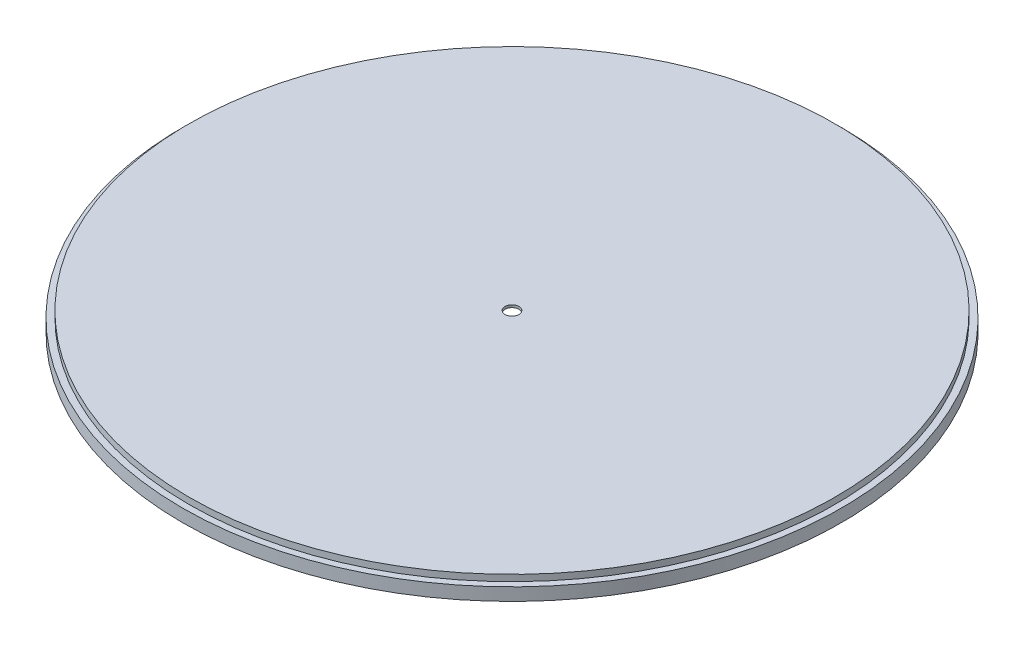
ISO-10303-21;
HEADER;
FILE_DESCRIPTION(('STEP AP214'),'2;1');
FILE_NAME('part.step','',(''),(''),'','','');
FILE_SCHEMA(('AUTOMOTIVE_DESIGN { 1 0 10303 214 1 1 1 1 }'));
ENDSEC;
DATA;
#1=APPLICATION_CONTEXT('core data for automotive mechanical design processes');
#2=APPLICATION_PROTOCOL_DEFINITION('international standard','automotive_design',2000,#1);
#3=PRODUCT_CONTEXT('',#1,'mechanical');
#4=PRODUCT('Part','Part','',(#3));
#5=PRODUCT_RELATED_PRODUCT_CATEGORY('part','',(#4));
#6=PRODUCT_DEFINITION_FORMATION('','',#4);
#7=PRODUCT_DEFINITION_CONTEXT('part definition',#1,'design');
#8=PRODUCT_DEFINITION('design','',#6,#7);
#9=PRODUCT_DEFINITION_SHAPE('','',#8);
#10=(LENGTH_UNIT() NAMED_UNIT(*) SI_UNIT(.MILLI.,.METRE.));
#11=(NAMED_UNIT(*) PLANE_ANGLE_UNIT() SI_UNIT($,.RADIAN.));
#12=(NAMED_UNIT(*) SI_UNIT($,.STERADIAN.) SOLID_ANGLE_UNIT());
#13=UNCERTAINTY_MEASURE_WITH_UNIT(LENGTH_MEASURE(1.E-05),#10,'distance_accuracy_value','');
#14=(GEOMETRIC_REPRESENTATION_CONTEXT(3) GLOBAL_UNCERTAINTY_ASSIGNED_CONTEXT((#13)) GLOBAL_UNIT_ASSIGNED_CONTEXT((#10,
#11,#12)) REPRESENTATION_CONTEXT('',''));
#15=CARTESIAN_POINT('',(0.,0.,0.));
#16=DIRECTION('',(0.,0.,1.));
#17=DIRECTION('',(1.,0.,0.));
#18=AXIS2_PLACEMENT_3D('',#15,#16,#17);
#19=CARTESIAN_POINT('',(0.,-1.5,0.));
#20=DIRECTION('',(0.,1.,0.));
#21=DIRECTION('',(0.,0.,1.));
#22=AXIS2_PLACEMENT_3D('',#19,#20,#21);
#23=CYLINDRICAL_SURFACE('',#22,25.5);
#24=CARTESIAN_POINT('',(0.,0.,0.));
#25=DIRECTION('',(0.,1.,0.));
#26=DIRECTION('',(0.,0.,1.));
#27=AXIS2_PLACEMENT_3D('',#24,#25,#26);
#28=CIRCLE('',#27,25.5);
#29=CARTESIAN_POINT('',(0.,0.,25.5));
#30=VERTEX_POINT('',#29);
#31=EDGE_CURVE('E10',#30,#30,#28,.T.);
#32=ORIENTED_EDGE('',*,*,#31,.F.);
#33=EDGE_LOOP('',(#32));
#34=FACE_BOUND('',#33,.T.);
#35=CARTESIAN_POINT('',(0.,-0.5,0.));
#36=DIRECTION('',(0.,-1.,0.));
#37=DIRECTION('',(0.,0.,-1.));
#38=AXIS2_PLACEMENT_3D('',#35,#36,#37);
#39=CIRCLE('',#38,25.5);
#40=CARTESIAN_POINT('',(0.,-0.5,-25.5));
#41=VERTEX_POINT('',#40);
#42=EDGE_CURVE('E44',#41,#41,#39,.F.);
#43=ORIENTED_EDGE('',*,*,#42,.T.);
#44=EDGE_LOOP('',(#43));
#45=FACE_BOUND('',#44,.T.);
#46=ADVANCED_FACE('F41',(#34,#45),#23,.T.);
#47=CARTESIAN_POINT('',(0.,0.,0.));
#48=DIRECTION('',(0.,1.,0.));
#49=DIRECTION('',(0.,0.,1.));
#50=AXIS2_PLACEMENT_3D('',#47,#48,#49);
#51=PLANE('',#50);
#52=CARTESIAN_POINT('',(0.,0.,0.));
#53=DIRECTION('',(0.,-1.,0.));
#54=DIRECTION('',(0.,0.,-1.));
#55=AXIS2_PLACEMENT_3D('',#52,#53,#54);
#56=CIRCLE('',#55,0.55);
#57=CARTESIAN_POINT('',(0.,0.,-0.55));
#58=VERTEX_POINT('',#57);
#59=EDGE_CURVE('E64',#58,#58,#56,.T.);
#60=ORIENTED_EDGE('',*,*,#59,.T.);
#61=EDGE_LOOP('',(#60));
#62=FACE_BOUND('',#61,.T.);
#63=ORIENTED_EDGE('',*,*,#31,.T.);
#64=EDGE_LOOP('',(#63));
#65=FACE_BOUND('',#64,.T.);
#66=ADVANCED_FACE('F68',(#62,#65),#51,.T.);
#67=CARTESIAN_POINT('',(0.,-0.5,0.));
#68=DIRECTION('',(0.,-1.,0.));
#69=DIRECTION('',(0.,0.,-1.));
#70=AXIS2_PLACEMENT_3D('',#67,#68,#69);
#71=CYLINDRICAL_SURFACE('',#70,26.);
#72=CARTESIAN_POINT('',(0.,-0.5,0.));
#73=DIRECTION('',(0.,-1.,0.));
#74=DIRECTION('',(0.,0.,-1.));
#75=AXIS2_PLACEMENT_3D('',#72,#73,#74);
#76=CIRCLE('',#75,26.);
#77=CARTESIAN_POINT('',(0.,-0.5,-26.));
#78=VERTEX_POINT('',#77);
#79=EDGE_CURVE('E51',#78,#78,#76,.T.);
#80=ORIENTED_EDGE('',*,*,#79,.T.);
#81=EDGE_LOOP('',(#80));
#82=FACE_BOUND('',#81,.T.);
#83=CARTESIAN_POINT('',(0.,-1.5,0.));
#84=DIRECTION('',(0.,-1.,0.));
#85=DIRECTION('',(0.,0.,-1.));
#86=AXIS2_PLACEMENT_3D('',#83,#84,#85);
#87=CIRCLE('',#86,26.);
#88=CARTESIAN_POINT('',(0.,-1.5,-26.));
#89=VERTEX_POINT('',#88);
#90=EDGE_CURVE('E53',#89,#89,#87,.T.);
#91=ORIENTED_EDGE('',*,*,#90,.F.);
#92=EDGE_LOOP('',(#91));
#93=FACE_BOUND('',#92,.T.);
#94=ADVANCED_FACE('F89',(#82,#93),#71,.T.);
#95=CARTESIAN_POINT('',(0.,-0.5,0.));
#96=DIRECTION('',(0.,-1.,0.));
#97=DIRECTION('',(0.,0.,-1.));
#98=AXIS2_PLACEMENT_3D('',#95,#96,#97);
#99=PLANE('',#98);
#100=ORIENTED_EDGE('',*,*,#42,.F.);
#101=EDGE_LOOP('',(#100));
#102=FACE_BOUND('',#101,.T.);
#103=ORIENTED_EDGE('',*,*,#79,.F.);
#104=EDGE_LOOP('',(#103));
#105=FACE_BOUND('',#104,.T.);
#106=ADVANCED_FACE('F85',(#102,#105),#99,.F.);
#107=CARTESIAN_POINT('',(0.,-1.5,0.));
#108=DIRECTION('',(0.,1.,0.));
#109=DIRECTION('',(0.,0.,1.));
#110=AXIS2_PLACEMENT_3D('',#107,#108,#109);
#111=PLANE('',#110);
#112=CARTESIAN_POINT('',(0.,-1.5,0.));
#113=DIRECTION('',(0.,-1.,0.));
#114=DIRECTION('',(0.,0.,-1.));
#115=AXIS2_PLACEMENT_3D('',#112,#113,#114);
#116=CIRCLE('',#115,4.35);
#117=CARTESIAN_POINT('',(0.,-1.5,-4.35));
#118=VERTEX_POINT('',#117);
#119=EDGE_CURVE('E56',#118,#118,#116,.T.);
#120=ORIENTED_EDGE('',*,*,#119,.F.);
#121=EDGE_LOOP('',(#120));
#122=FACE_BOUND('',#121,.T.);
#123=ORIENTED_EDGE('',*,*,#90,.T.);
#124=EDGE_LOOP('',(#123));
#125=FACE_BOUND('',#124,.T.);
#126=ADVANCED_FACE('F79',(#122,#125),#111,.F.);
#127=CARTESIAN_POINT('',(0.,-1.5,0.));
#128=DIRECTION('',(0.,-1.,0.));
#129=DIRECTION('',(0.,0.,-1.));
#130=AXIS2_PLACEMENT_3D('',#127,#128,#129);
#131=CONICAL_SURFACE('',#130,4.35,1.24117191937415);
#132=CARTESIAN_POINT('',(0.,-0.2,0.));
#133=DIRECTION('',(0.,-1.,0.));
#134=DIRECTION('',(0.,0.,-1.));
#135=AXIS2_PLACEMENT_3D('',#132,#133,#134);
#136=CIRCLE('',#135,0.55);
#137=CARTESIAN_POINT('',(0.,-0.2,-0.549999999999999));
#138=VERTEX_POINT('',#137);
#139=EDGE_CURVE('E61',#138,#138,#136,.T.);
#140=CARTESIAN_POINT('',(0.,-0.2,-0.549999999999999));
#141=CARTESIAN_POINT('',(0.,-0.213541666666667,-0.589583333333332));
#142=CARTESIAN_POINT('',(0.,-0.227083333333333,-0.629166666666666));
#143=CARTESIAN_POINT('',(0.,-0.254166666666667,-0.708333333333332));
#144=CARTESIAN_POINT('',(0.,-0.267708333333333,-0.747916666666665));
#145=CARTESIAN_POINT('',(0.,-0.294791666666667,-0.827083333333332));
#146=CARTESIAN_POINT('',(0.,-0.308333333333333,-0.866666666666666));
#147=CARTESIAN_POINT('',(0.,-0.335416666666667,-0.945833333333332));
#148=CARTESIAN_POINT('',(0.,-0.348958333333333,-0.985416666666665));
#149=CARTESIAN_POINT('',(0.,-0.376041666666667,-1.06458333333333));
#150=CARTESIAN_POINT('',(0.,-0.389583333333333,-1.10416666666667));
#151=CARTESIAN_POINT('',(0.,-0.416666666666667,-1.18333333333333));
#152=CARTESIAN_POINT('',(0.,-0.430208333333333,-1.22291666666667));
#153=CARTESIAN_POINT('',(0.,-0.457291666666667,-1.30208333333333));
#154=CARTESIAN_POINT('',(0.,-0.470833333333333,-1.34166666666667));
#155=CARTESIAN_POINT('',(0.,-0.497916666666667,-1.42083333333333));
#156=CARTESIAN_POINT('',(0.,-0.511458333333333,-1.46041666666667));
#157=CARTESIAN_POINT('',(0.,-0.538541666666667,-1.53958333333333));
#158=CARTESIAN_POINT('',(0.,-0.552083333333333,-1.57916666666667));
#159=CARTESIAN_POINT('',(0.,-0.579166666666667,-1.65833333333333));
#160=CARTESIAN_POINT('',(0.,-0.592708333333333,-1.69791666666667));
#161=CARTESIAN_POINT('',(0.,-0.619791666666667,-1.77708333333333));
#162=CARTESIAN_POINT('',(0.,-0.633333333333333,-1.81666666666667));
#163=CARTESIAN_POINT('',(0.,-0.660416666666667,-1.89583333333333));
#164=CARTESIAN_POINT('',(0.,-0.673958333333333,-1.93541666666667));
#165=CARTESIAN_POINT('',(0.,-0.701041666666667,-2.01458333333333));
#166=CARTESIAN_POINT('',(0.,-0.714583333333333,-2.05416666666667));
#167=CARTESIAN_POINT('',(0.,-0.741666666666667,-2.13333333333333));
#168=CARTESIAN_POINT('',(0.,-0.755208333333333,-2.17291666666667));
#169=CARTESIAN_POINT('',(0.,-0.782291666666667,-2.25208333333333));
#170=CARTESIAN_POINT('',(0.,-0.795833333333333,-2.29166666666667));
#171=CARTESIAN_POINT('',(0.,-0.822916666666667,-2.37083333333333));
#172=CARTESIAN_POINT('',(0.,-0.836458333333333,-2.41041666666667));
#173=CARTESIAN_POINT('',(0.,-0.863541666666667,-2.48958333333333));
#174=CARTESIAN_POINT('',(0.,-0.877083333333333,-2.52916666666667));
#175=CARTESIAN_POINT('',(0.,-0.904166666666667,-2.60833333333333));
#176=CARTESIAN_POINT('',(0.,-0.917708333333333,-2.64791666666667));
#177=CARTESIAN_POINT('',(0.,-0.944791666666667,-2.72708333333333));
#178=CARTESIAN_POINT('',(0.,-0.958333333333333,-2.76666666666667));
#179=CARTESIAN_POINT('',(0.,-0.985416666666667,-2.84583333333333));
#180=CARTESIAN_POINT('',(0.,-0.998958333333333,-2.88541666666667));
#181=CARTESIAN_POINT('',(0.,-1.02604166666667,-2.96458333333333));
#182=CARTESIAN_POINT('',(0.,-1.03958333333333,-3.00416666666667));
#183=CARTESIAN_POINT('',(0.,-1.06666666666667,-3.08333333333333));
#184=CARTESIAN_POINT('',(0.,-1.08020833333333,-3.12291666666667));
#185=CARTESIAN_POINT('',(0.,-1.10729166666667,-3.20208333333333));
#186=CARTESIAN_POINT('',(0.,-1.12083333333333,-3.24166666666667));
#187=CARTESIAN_POINT('',(0.,-1.14791666666667,-3.32083333333333));
#188=CARTESIAN_POINT('',(0.,-1.16145833333333,-3.36041666666667));
#189=CARTESIAN_POINT('',(0.,-1.18854166666667,-3.43958333333333));
#190=CARTESIAN_POINT('',(0.,-1.20208333333333,-3.47916666666667));
#191=CARTESIAN_POINT('',(0.,-1.22916666666667,-3.55833333333333));
#192=CARTESIAN_POINT('',(0.,-1.24270833333333,-3.59791666666667));
#193=CARTESIAN_POINT('',(0.,-1.26979166666667,-3.67708333333333));
#194=CARTESIAN_POINT('',(0.,-1.28333333333333,-3.71666666666667));
#195=CARTESIAN_POINT('',(0.,-1.31041666666667,-3.79583333333333));
#196=CARTESIAN_POINT('',(0.,-1.32395833333333,-3.83541666666667));
#197=CARTESIAN_POINT('',(0.,-1.35104166666667,-3.91458333333333));
#198=CARTESIAN_POINT('',(0.,-1.36458333333333,-3.95416666666667));
#199=CARTESIAN_POINT('',(0.,-1.39166666666667,-4.03333333333333));
#200=CARTESIAN_POINT('',(0.,-1.40520833333333,-4.07291666666667));
#201=CARTESIAN_POINT('',(0.,-1.43229166666667,-4.15208333333333));
#202=CARTESIAN_POINT('',(0.,-1.44583333333333,-4.19166666666667));
#203=CARTESIAN_POINT('',(0.,-1.47291666666667,-4.27083333333333));
#204=CARTESIAN_POINT('',(0.,-1.48645833333333,-4.31041666666667));
#205=CARTESIAN_POINT('',(0.,-1.5,-4.35));
#206=B_SPLINE_CURVE_WITH_KNOTS('',3,(#140,#141,#142,#143,#144,#145,#146,#147,#148,#149,#150,
#151,#152,#153,#154,#155,#156,#157,#158,#159,#160,#161,#162,#163,#164,#165,#166,#167,#168,#169,
#170,#171,#172,#173,#174,#175,#176,#177,#178,#179,#180,#181,#182,#183,#184,#185,#186,#187,#188,
#189,#190,#191,#192,#193,#194,#195,#196,#197,#198,#199,#200,#201,#202,#203,#204,#205),
.UNSPECIFIED.,.F.,.F.,(4,2,2,2,2,2,2,2,2,2,2,2,2,2,2,2,2,2,2,2,2,2,2,2,2,2,2,2,2,2,2,2,4),(0.,
0.125506785175145,0.25101357035029,0.376520355525435,0.50202714070058,0.627533925875725,
0.753040711050871,0.878547496226015,1.00405428140116,1.12956106657631,1.25506785175145,
1.3805746369266,1.50608142210174,1.63158820727689,1.75709499245203,1.88260177762718,
2.00810856280232,2.13361534797747,2.25912213315261,2.38462891832776,2.5101357035029,
2.63564248867805,2.76114927385319,2.88665605902834,3.01216284420348,3.13766962937863,
3.26317641455377,3.38868319972892,3.51418998490406,3.63969677007921,3.76520355525435,
3.8907103404295,4.01621712560464),.UNSPECIFIED.);
#207=EDGE_CURVE('BSEAM73',#138,#118,#206,.T.);
#208=ORIENTED_EDGE('',*,*,#139,.F.);
#209=ORIENTED_EDGE('',*,*,#119,.T.);
#210=ORIENTED_EDGE('',*,*,#207,.T.);
#211=ORIENTED_EDGE('',*,*,#207,.F.);
#212=EDGE_LOOP('',(#208,#210,#209,#211));
#213=FACE_BOUND('',#212,.T.);
#214=ADVANCED_FACE('F73',(#213),#131,.F.);
#215=CARTESIAN_POINT('',(0.,-1.5,0.));
#216=DIRECTION('',(0.,-1.,0.));
#217=DIRECTION('',(0.,0.,-1.));
#218=AXIS2_PLACEMENT_3D('',#215,#216,#217);
#219=CYLINDRICAL_SURFACE('',#218,0.55);
#220=ORIENTED_EDGE('',*,*,#59,.F.);
#221=EDGE_LOOP('',(#220));
#222=FACE_BOUND('',#221,.T.);
#223=ORIENTED_EDGE('',*,*,#139,.T.);
#224=EDGE_LOOP('',(#223));
#225=FACE_BOUND('',#224,.T.);
#226=ADVANCED_FACE('F70',(#222,#225),#219,.F.);
#227=CLOSED_SHELL('',(#46,#66,#94,#106,#126,#214,#226));
#228=MANIFOLD_SOLID_BREP('B2',#227);
#229=ADVANCED_BREP_SHAPE_REPRESENTATION('',(#18,#228),#14);
#230=SHAPE_DEFINITION_REPRESENTATION(#9,#229);
ENDSEC;
END-ISO-10303-21;
